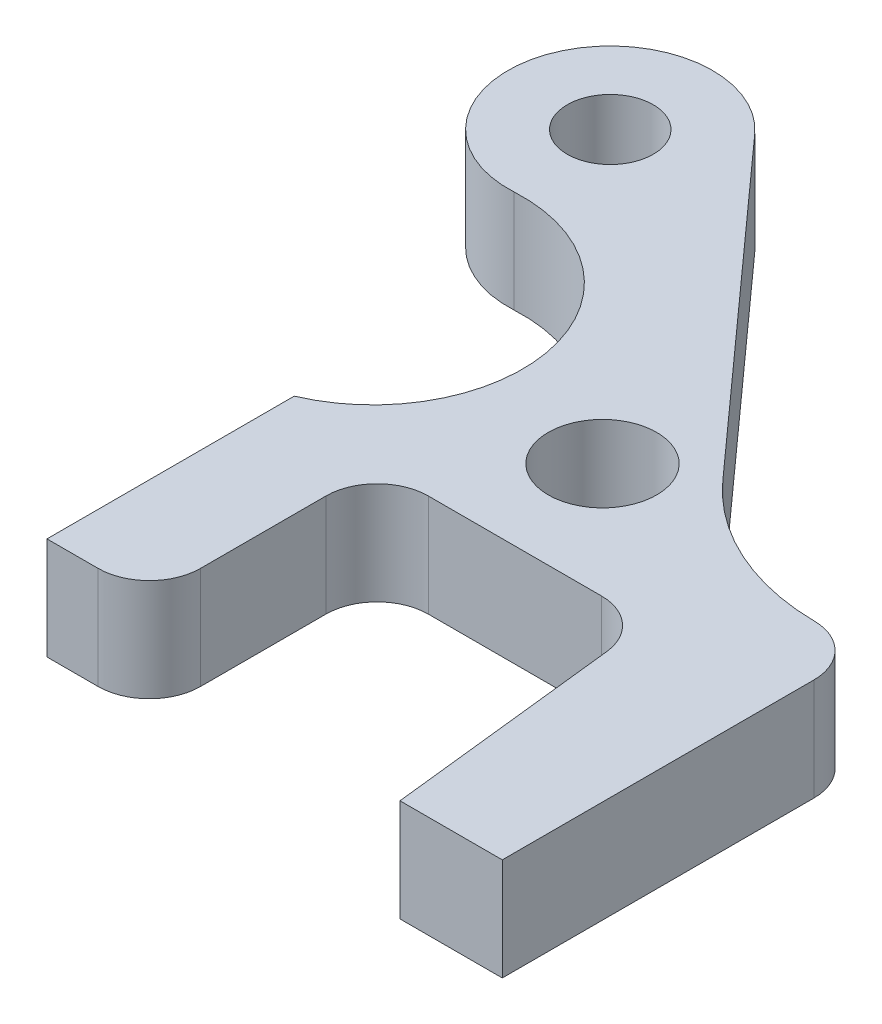
ISO-10303-21;
HEADER;
FILE_DESCRIPTION(('STEP AP214'),'2;1');
FILE_NAME('part.step','',(''),(''),'','','');
FILE_SCHEMA(('AUTOMOTIVE_DESIGN { 1 0 10303 214 1 1 1 1 }'));
ENDSEC;
DATA;
#1=APPLICATION_CONTEXT('core data for automotive mechanical design processes');
#2=APPLICATION_PROTOCOL_DEFINITION('international standard','automotive_design',2000,#1);
#3=PRODUCT_CONTEXT('',#1,'mechanical');
#4=PRODUCT('Part','Part','',(#3));
#5=PRODUCT_RELATED_PRODUCT_CATEGORY('part','',(#4));
#6=PRODUCT_DEFINITION_FORMATION('','',#4);
#7=PRODUCT_DEFINITION_CONTEXT('part definition',#1,'design');
#8=PRODUCT_DEFINITION('design','',#6,#7);
#9=PRODUCT_DEFINITION_SHAPE('','',#8);
#10=(LENGTH_UNIT() NAMED_UNIT(*) SI_UNIT(.MILLI.,.METRE.));
#11=(NAMED_UNIT(*) PLANE_ANGLE_UNIT() SI_UNIT($,.RADIAN.));
#12=(NAMED_UNIT(*) SI_UNIT($,.STERADIAN.) SOLID_ANGLE_UNIT());
#13=UNCERTAINTY_MEASURE_WITH_UNIT(LENGTH_MEASURE(1.E-05),#10,'distance_accuracy_value','');
#14=(GEOMETRIC_REPRESENTATION_CONTEXT(3) GLOBAL_UNCERTAINTY_ASSIGNED_CONTEXT((#13)) GLOBAL_UNIT_ASSIGNED_CONTEXT((#10,
#11,#12)) REPRESENTATION_CONTEXT('',''));
#15=CARTESIAN_POINT('',(0.,0.,0.));
#16=DIRECTION('',(0.,0.,1.));
#17=DIRECTION('',(1.,0.,0.));
#18=AXIS2_PLACEMENT_3D('',#15,#16,#17);
#19=CARTESIAN_POINT('',(0.,-5.,-1.07552855510562E-12));
#20=DIRECTION('',(0.,1.,0.));
#21=DIRECTION('',(0.,0.,1.));
#22=AXIS2_PLACEMENT_3D('',#19,#20,#21);
#23=CYLINDRICAL_SURFACE('',#22,5.00000000000001);
#24=CARTESIAN_POINT('',(0.,0.,-1.07552855510562E-12));
#25=DIRECTION('',(0.,1.,0.));
#26=DIRECTION('',(0.,0.,1.));
#27=AXIS2_PLACEMENT_3D('',#24,#25,#26);
#28=CIRCLE('',#27,5.00000000000001);
#29=CARTESIAN_POINT('',(3.71832057184778,0.,-3.34276713591911));
#30=VERTEX_POINT('',#29);
#31=CARTESIAN_POINT('',(0.291809825642227,0.,4.99147743916047));
#32=VERTEX_POINT('',#31);
#33=EDGE_CURVE('E170',#30,#32,#28,.T.);
#34=ORIENTED_EDGE('',*,*,#33,.F.);
#35=DIRECTION('',(0.,1.,0.));
#36=VECTOR('',#35,1.);
#37=CARTESIAN_POINT('',(3.71832057184778,-5.,-3.34276713591911));
#38=LINE('',#37,#36);
#39=CARTESIAN_POINT('',(3.71832057184778,-5.,-3.34276713591911));
#40=VERTEX_POINT('',#39);
#41=EDGE_CURVE('E11',#40,#30,#38,.T.);
#42=ORIENTED_EDGE('',*,*,#41,.F.);
#43=CARTESIAN_POINT('',(0.,-5.,-1.07552855510562E-12));
#44=DIRECTION('',(0.,1.,0.));
#45=DIRECTION('',(0.,0.,1.));
#46=AXIS2_PLACEMENT_3D('',#43,#44,#45);
#47=CIRCLE('',#46,5.00000000000001);
#48=CARTESIAN_POINT('',(0.291809825642227,-5.,4.99147743916047));
#49=VERTEX_POINT('',#48);
#50=EDGE_CURVE('E212',#40,#49,#47,.T.);
#51=ORIENTED_EDGE('',*,*,#50,.T.);
#52=DIRECTION('',(0.,1.,0.));
#53=VECTOR('',#52,1.);
#54=CARTESIAN_POINT('',(0.291809825642227,-5.,4.99147743916047));
#55=LINE('',#54,#53);
#56=EDGE_CURVE('E34',#49,#32,#55,.T.);
#57=ORIENTED_EDGE('',*,*,#56,.T.);
#58=EDGE_LOOP('',(#34,#42,#51,#57));
#59=FACE_BOUND('',#58,.T.);
#60=ADVANCED_FACE('F31',(#59),#23,.T.);
#61=CARTESIAN_POINT('',(3.71832057184778,-5.,-3.34276713591911));
#62=DIRECTION('',(0.743664114369555,0.,-0.668553427183606));
#63=DIRECTION('',(-0.668553427183606,0.,-0.743664114369555));
#64=AXIS2_PLACEMENT_3D('',#61,#62,#63);
#65=PLANE('',#64);
#66=DIRECTION('',(-0.668553427183606,0.,-0.743664114369555));
#67=VECTOR('',#66,1.);
#68=CARTESIAN_POINT('',(3.71832057184778,0.,-3.34276713591911));
#69=LINE('',#68,#67);
#70=CARTESIAN_POINT('',(17.6183743657092,0.,12.118930873539));
#71=VERTEX_POINT('',#70);
#72=EDGE_CURVE('E210',#71,#30,#69,.T.);
#73=ORIENTED_EDGE('',*,*,#72,.F.);
#74=DIRECTION('',(0.,1.,0.));
#75=VECTOR('',#74,1.);
#76=CARTESIAN_POINT('',(17.6183743657092,-5.,12.118930873539));
#77=LINE('',#76,#75);
#78=CARTESIAN_POINT('',(17.6183743657092,-5.,12.118930873539));
#79=VERTEX_POINT('',#78);
#80=EDGE_CURVE('E40',#79,#71,#77,.T.);
#81=ORIENTED_EDGE('',*,*,#80,.F.);
#82=DIRECTION('',(-0.668553427183606,0.,-0.743664114369555));
#83=VECTOR('',#82,1.);
#84=CARTESIAN_POINT('',(3.71832057184778,-5.,-3.34276713591911));
#85=LINE('',#84,#83);
#86=EDGE_CURVE('E160',#79,#40,#85,.T.);
#87=ORIENTED_EDGE('',*,*,#86,.T.);
#88=ORIENTED_EDGE('',*,*,#41,.T.);
#89=EDGE_LOOP('',(#73,#81,#87,#88));
#90=FACE_BOUND('',#89,.T.);
#91=ADVANCED_FACE('F238',(#90),#65,.T.);
#92=CARTESIAN_POINT('',(25.9164295757043,-5.,4.65898606457902));
#93=DIRECTION('',(0.,1.,0.));
#94=DIRECTION('',(0.,0.,1.));
#95=AXIS2_PLACEMENT_3D('',#92,#93,#94);
#96=CYLINDRICAL_SURFACE('',#95,11.1583375473614);
#97=CARTESIAN_POINT('',(25.9164295757043,0.,4.65898606457902));
#98=DIRECTION('',(0.,-1.,0.));
#99=DIRECTION('',(0.,0.,1.));
#100=AXIS2_PLACEMENT_3D('',#97,#98,#99);
#101=CIRCLE('',#100,11.1583375473614);
#102=CARTESIAN_POINT('',(25.7960671213815,0.,15.8166744318191));
#103=VERTEX_POINT('',#102);
#104=EDGE_CURVE('E147',#103,#71,#101,.T.);
#105=ORIENTED_EDGE('',*,*,#104,.F.);
#106=DIRECTION('',(0.,1.,0.));
#107=VECTOR('',#106,1.);
#108=CARTESIAN_POINT('',(25.7960671213815,-5.,15.8166744318191));
#109=LINE('',#108,#107);
#110=CARTESIAN_POINT('',(25.7960671213815,-5.,15.8166744318191));
#111=VERTEX_POINT('',#110);
#112=EDGE_CURVE('E142',#111,#103,#109,.T.);
#113=ORIENTED_EDGE('',*,*,#112,.F.);
#114=CARTESIAN_POINT('',(25.9164295757043,-5.,4.65898606457902));
#115=DIRECTION('',(0.,-1.,0.));
#116=DIRECTION('',(0.,0.,1.));
#117=AXIS2_PLACEMENT_3D('',#114,#115,#116);
#118=CIRCLE('',#117,11.1583375473614);
#119=EDGE_CURVE('E145',#111,#79,#118,.T.);
#120=ORIENTED_EDGE('',*,*,#119,.T.);
#121=ORIENTED_EDGE('',*,*,#80,.T.);
#122=EDGE_LOOP('',(#105,#113,#120,#121));
#123=FACE_BOUND('',#122,.T.);
#124=ADVANCED_FACE('F144',(#123),#96,.F.);
#125=CARTESIAN_POINT('',(25.7691001888497,-5.,18.3165289844981));
#126=DIRECTION('',(0.,1.,0.));
#127=DIRECTION('',(0.,0.,1.));
#128=AXIS2_PLACEMENT_3D('',#125,#126,#127);
#129=CYLINDRICAL_SURFACE('',#128,2.50000000000001);
#130=CARTESIAN_POINT('',(25.7691001888497,0.,18.3165289844981));
#131=DIRECTION('',(0.,1.,0.));
#132=DIRECTION('',(0.,0.,-1.));
#133=AXIS2_PLACEMENT_3D('',#130,#131,#132);
#134=CIRCLE('',#133,2.50000000000001);
#135=CARTESIAN_POINT('',(28.2691001888497,0.,18.3165289844981));
#136=VERTEX_POINT('',#135);
#137=EDGE_CURVE('E207',#136,#103,#134,.T.);
#138=ORIENTED_EDGE('',*,*,#137,.F.);
#139=DIRECTION('',(0.,1.,0.));
#140=VECTOR('',#139,1.);
#141=CARTESIAN_POINT('',(28.2691001888497,-5.,18.3165289844981));
#142=LINE('',#141,#140);
#143=CARTESIAN_POINT('',(28.2691001888497,-5.,18.3165289844981));
#144=VERTEX_POINT('',#143);
#145=EDGE_CURVE('E152',#144,#136,#142,.T.);
#146=ORIENTED_EDGE('',*,*,#145,.F.);
#147=CARTESIAN_POINT('',(25.7691001888497,-5.,18.3165289844981));
#148=DIRECTION('',(0.,1.,0.));
#149=DIRECTION('',(0.,0.,-1.));
#150=AXIS2_PLACEMENT_3D('',#147,#148,#149);
#151=CIRCLE('',#150,2.50000000000001);
#152=EDGE_CURVE('E158',#144,#111,#151,.T.);
#153=ORIENTED_EDGE('',*,*,#152,.T.);
#154=ORIENTED_EDGE('',*,*,#112,.T.);
#155=EDGE_LOOP('',(#138,#146,#153,#154));
#156=FACE_BOUND('',#155,.T.);
#157=ADVANCED_FACE('F162',(#156),#129,.T.);
#158=CARTESIAN_POINT('',(28.2691001888498,-5.,33.5446843123103));
#159=DIRECTION('',(1.,0.,0.));
#160=DIRECTION('',(0.,0.,-1.));
#161=AXIS2_PLACEMENT_3D('',#158,#159,#160);
#162=PLANE('',#161);
#163=DIRECTION('',(0.,0.,-1.));
#164=VECTOR('',#163,1.);
#165=CARTESIAN_POINT('',(28.2691001888498,0.,33.5446843123103));
#166=LINE('',#165,#164);
#167=CARTESIAN_POINT('',(28.2691001888498,0.,33.5446843123103));
#168=VERTEX_POINT('',#167);
#169=EDGE_CURVE('E204',#168,#136,#166,.T.);
#170=ORIENTED_EDGE('',*,*,#169,.F.);
#171=DIRECTION('',(0.,1.,0.));
#172=VECTOR('',#171,1.);
#173=CARTESIAN_POINT('',(28.2691001888498,-5.,33.5446843123103));
#174=LINE('',#173,#172);
#175=CARTESIAN_POINT('',(28.2691001888498,-5.,33.5446843123103));
#176=VERTEX_POINT('',#175);
#177=EDGE_CURVE('E216',#176,#168,#174,.T.);
#178=ORIENTED_EDGE('',*,*,#177,.F.);
#179=DIRECTION('',(0.,0.,-1.));
#180=VECTOR('',#179,1.);
#181=CARTESIAN_POINT('',(28.2691001888498,-5.,33.5446843123103));
#182=LINE('',#181,#180);
#183=EDGE_CURVE('E163',#176,#144,#182,.T.);
#184=ORIENTED_EDGE('',*,*,#183,.T.);
#185=ORIENTED_EDGE('',*,*,#145,.T.);
#186=EDGE_LOOP('',(#170,#178,#184,#185));
#187=FACE_BOUND('',#186,.T.);
#188=ADVANCED_FACE('F251',(#187),#162,.T.);
#189=CARTESIAN_POINT('',(23.2691001888498,-5.,33.5446843123103));
#190=DIRECTION('',(0.,0.,1.));
#191=DIRECTION('',(1.,0.,0.));
#192=AXIS2_PLACEMENT_3D('',#189,#190,#191);
#193=PLANE('',#192);
#194=DIRECTION('',(1.,0.,0.));
#195=VECTOR('',#194,1.);
#196=CARTESIAN_POINT('',(23.2691001888498,0.,33.5446843123103));
#197=LINE('',#196,#195);
#198=CARTESIAN_POINT('',(23.2691001888498,0.,33.5446843123103));
#199=VERTEX_POINT('',#198);
#200=EDGE_CURVE('E201',#199,#168,#197,.T.);
#201=ORIENTED_EDGE('',*,*,#200,.F.);
#202=DIRECTION('',(0.,1.,0.));
#203=VECTOR('',#202,1.);
#204=CARTESIAN_POINT('',(23.2691001888498,-5.,33.5446843123103));
#205=LINE('',#204,#203);
#206=CARTESIAN_POINT('',(23.2691001888498,-5.,33.5446843123103));
#207=VERTEX_POINT('',#206);
#208=EDGE_CURVE('E218',#207,#199,#205,.T.);
#209=ORIENTED_EDGE('',*,*,#208,.F.);
#210=DIRECTION('',(1.,0.,0.));
#211=VECTOR('',#210,1.);
#212=CARTESIAN_POINT('',(23.2691001888498,-5.,33.5446843123103));
#213=LINE('',#212,#211);
#214=EDGE_CURVE('E165',#207,#176,#213,.T.);
#215=ORIENTED_EDGE('',*,*,#214,.T.);
#216=ORIENTED_EDGE('',*,*,#177,.T.);
#217=EDGE_LOOP('',(#201,#209,#215,#216));
#218=FACE_BOUND('',#217,.T.);
#219=ADVANCED_FACE('F254',(#218),#193,.T.);
#220=CARTESIAN_POINT('',(22.0073956861614,-5.,22.1778849571099));
#221=DIRECTION('',(-0.993895947407551,0.,0.110321556038912));
#222=DIRECTION('',(0.110321556038912,0.,0.993895947407551));
#223=AXIS2_PLACEMENT_3D('',#220,#221,#222);
#224=PLANE('',#223);
#225=DIRECTION('',(0.110321556038912,0.,0.993895947407551));
#226=VECTOR('',#225,1.);
#227=CARTESIAN_POINT('',(22.0073956861614,0.,22.1778849571099));
#228=LINE('',#227,#226);
#229=CARTESIAN_POINT('',(22.0073956861614,0.,22.1778849571099));
#230=VERTEX_POINT('',#229);
#231=EDGE_CURVE('E198',#230,#199,#228,.T.);
#232=ORIENTED_EDGE('',*,*,#231,.F.);
#233=DIRECTION('',(0.,1.,0.));
#234=VECTOR('',#233,1.);
#235=CARTESIAN_POINT('',(22.0073956861614,-5.,22.1778849571099));
#236=LINE('',#235,#234);
#237=CARTESIAN_POINT('',(22.0073956861614,-5.,22.1778849571099));
#238=VERTEX_POINT('',#237);
#239=EDGE_CURVE('E220',#238,#230,#236,.T.);
#240=ORIENTED_EDGE('',*,*,#239,.F.);
#241=DIRECTION('',(0.110321556038912,0.,0.993895947407551));
#242=VECTOR('',#241,1.);
#243=CARTESIAN_POINT('',(22.0073956861614,-5.,22.1778849571099));
#244=LINE('',#243,#242);
#245=EDGE_CURVE('E349',#238,#207,#244,.T.);
#246=ORIENTED_EDGE('',*,*,#245,.T.);
#247=ORIENTED_EDGE('',*,*,#208,.T.);
#248=EDGE_LOOP('',(#232,#240,#246,#247));
#249=FACE_BOUND('',#248,.T.);
#250=ADVANCED_FACE('F258',(#249),#224,.T.);
#251=CARTESIAN_POINT('',(19.5226558176426,-5.,22.4536888472072));
#252=DIRECTION('',(0.,1.,0.));
#253=DIRECTION('',(0.,0.,1.));
#254=AXIS2_PLACEMENT_3D('',#251,#252,#253);
#255=CYLINDRICAL_SURFACE('',#254,2.5);
#256=CARTESIAN_POINT('',(19.5226558176426,0.,22.4536888472072));
#257=DIRECTION('',(0.,-1.,0.));
#258=DIRECTION('',(0.,0.,-1.));
#259=AXIS2_PLACEMENT_3D('',#256,#257,#258);
#260=CIRCLE('',#259,2.5);
#261=CARTESIAN_POINT('',(19.5226558176426,0.,19.9536888472072));
#262=VERTEX_POINT('',#261);
#263=EDGE_CURVE('E195',#262,#230,#260,.T.);
#264=ORIENTED_EDGE('',*,*,#263,.F.);
#265=DIRECTION('',(0.,1.,0.));
#266=VECTOR('',#265,1.);
#267=CARTESIAN_POINT('',(19.5226558176426,-5.,19.9536888472072));
#268=LINE('',#267,#266);
#269=CARTESIAN_POINT('',(19.5226558176426,-5.,19.9536888472072));
#270=VERTEX_POINT('',#269);
#271=EDGE_CURVE('E222',#270,#262,#268,.T.);
#272=ORIENTED_EDGE('',*,*,#271,.F.);
#273=CARTESIAN_POINT('',(19.5226558176426,-5.,22.4536888472072));
#274=DIRECTION('',(0.,-1.,0.));
#275=DIRECTION('',(0.,0.,-1.));
#276=AXIS2_PLACEMENT_3D('',#273,#274,#275);
#277=CIRCLE('',#276,2.5);
#278=EDGE_CURVE('E346',#270,#238,#277,.T.);
#279=ORIENTED_EDGE('',*,*,#278,.T.);
#280=ORIENTED_EDGE('',*,*,#239,.T.);
#281=EDGE_LOOP('',(#264,#272,#279,#280));
#282=FACE_BOUND('',#281,.T.);
#283=ADVANCED_FACE('F262',(#282),#255,.F.);
#284=CARTESIAN_POINT('',(11.0616912661466,-5.,19.9536888472072));
#285=DIRECTION('',(0.,0.,1.));
#286=DIRECTION('',(1.,0.,0.));
#287=AXIS2_PLACEMENT_3D('',#284,#285,#286);
#288=PLANE('',#287);
#289=DIRECTION('',(1.,0.,0.));
#290=VECTOR('',#289,1.);
#291=CARTESIAN_POINT('',(11.0616912661466,0.,19.9536888472072));
#292=LINE('',#291,#290);
#293=CARTESIAN_POINT('',(11.0616912661466,0.,19.9536888472072));
#294=VERTEX_POINT('',#293);
#295=EDGE_CURVE('E192',#294,#262,#292,.T.);
#296=ORIENTED_EDGE('',*,*,#295,.F.);
#297=DIRECTION('',(0.,1.,0.));
#298=VECTOR('',#297,1.);
#299=CARTESIAN_POINT('',(11.0616912661466,-5.,19.9536888472072));
#300=LINE('',#299,#298);
#301=CARTESIAN_POINT('',(11.0616912661466,-5.,19.9536888472072));
#302=VERTEX_POINT('',#301);
#303=EDGE_CURVE('E224',#302,#294,#300,.T.);
#304=ORIENTED_EDGE('',*,*,#303,.F.);
#305=DIRECTION('',(1.,0.,0.));
#306=VECTOR('',#305,1.);
#307=CARTESIAN_POINT('',(11.0616912661466,-5.,19.9536888472072));
#308=LINE('',#307,#306);
#309=EDGE_CURVE('E343',#302,#270,#308,.T.);
#310=ORIENTED_EDGE('',*,*,#309,.T.);
#311=ORIENTED_EDGE('',*,*,#271,.T.);
#312=EDGE_LOOP('',(#296,#304,#310,#311));
#313=FACE_BOUND('',#312,.T.);
#314=ADVANCED_FACE('F266',(#313),#288,.T.);
#315=CARTESIAN_POINT('',(11.0616912661466,-5.,22.4536888472072));
#316=DIRECTION('',(0.,1.,0.));
#317=DIRECTION('',(0.,0.,1.));
#318=AXIS2_PLACEMENT_3D('',#315,#316,#317);
#319=CYLINDRICAL_SURFACE('',#318,2.5);
#320=CARTESIAN_POINT('',(11.0616912661466,0.,22.4536888472072));
#321=DIRECTION('',(0.,-1.,0.));
#322=DIRECTION('',(0.,0.,1.));
#323=AXIS2_PLACEMENT_3D('',#320,#321,#322);
#324=CIRCLE('',#323,2.5);
#325=CARTESIAN_POINT('',(8.56169126614657,0.,22.4536888472072));
#326=VERTEX_POINT('',#325);
#327=EDGE_CURVE('E189',#326,#294,#324,.T.);
#328=ORIENTED_EDGE('',*,*,#327,.F.);
#329=DIRECTION('',(0.,1.,0.));
#330=VECTOR('',#329,1.);
#331=CARTESIAN_POINT('',(8.56169126614657,-5.,22.4536888472072));
#332=LINE('',#331,#330);
#333=CARTESIAN_POINT('',(8.56169126614657,-5.,22.4536888472072));
#334=VERTEX_POINT('',#333);
#335=EDGE_CURVE('E226',#334,#326,#332,.T.);
#336=ORIENTED_EDGE('',*,*,#335,.F.);
#337=CARTESIAN_POINT('',(11.0616912661466,-5.,22.4536888472072));
#338=DIRECTION('',(0.,-1.,0.));
#339=DIRECTION('',(0.,0.,1.));
#340=AXIS2_PLACEMENT_3D('',#337,#338,#339);
#341=CIRCLE('',#340,2.5);
#342=EDGE_CURVE('E340',#334,#302,#341,.T.);
#343=ORIENTED_EDGE('',*,*,#342,.T.);
#344=ORIENTED_EDGE('',*,*,#303,.T.);
#345=EDGE_LOOP('',(#328,#336,#343,#344));
#346=FACE_BOUND('',#345,.T.);
#347=ADVANCED_FACE('F270',(#346),#319,.F.);
#348=CARTESIAN_POINT('',(8.56169126614662,-5.,28.5855436692577));
#349=DIRECTION('',(1.,0.,0.));
#350=DIRECTION('',(0.,0.,-1.));
#351=AXIS2_PLACEMENT_3D('',#348,#349,#350);
#352=PLANE('',#351);
#353=DIRECTION('',(0.,0.,-1.));
#354=VECTOR('',#353,1.);
#355=CARTESIAN_POINT('',(8.56169126614662,0.,28.5855436692577));
#356=LINE('',#355,#354);
#357=CARTESIAN_POINT('',(8.56169126614662,0.,28.5855436692577));
#358=VERTEX_POINT('',#357);
#359=EDGE_CURVE('E186',#358,#326,#356,.T.);
#360=ORIENTED_EDGE('',*,*,#359,.F.);
#361=DIRECTION('',(0.,1.,0.));
#362=VECTOR('',#361,1.);
#363=CARTESIAN_POINT('',(8.56169126614662,-5.,28.5855436692577));
#364=LINE('',#363,#362);
#365=CARTESIAN_POINT('',(8.56169126614662,-5.,28.5855436692577));
#366=VERTEX_POINT('',#365);
#367=EDGE_CURVE('E228',#366,#358,#364,.T.);
#368=ORIENTED_EDGE('',*,*,#367,.F.);
#369=DIRECTION('',(0.,0.,-1.));
#370=VECTOR('',#369,1.);
#371=CARTESIAN_POINT('',(8.56169126614662,-5.,28.5855436692577));
#372=LINE('',#371,#370);
#373=EDGE_CURVE('E337',#366,#334,#372,.T.);
#374=ORIENTED_EDGE('',*,*,#373,.T.);
#375=ORIENTED_EDGE('',*,*,#335,.T.);
#376=EDGE_LOOP('',(#360,#368,#374,#375));
#377=FACE_BOUND('',#376,.T.);
#378=ADVANCED_FACE('F274',(#377),#352,.T.);
#379=CARTESIAN_POINT('',(6.06169126614661,-5.,28.5855436692577));
#380=DIRECTION('',(0.,1.,0.));
#381=DIRECTION('',(0.,0.,1.));
#382=AXIS2_PLACEMENT_3D('',#379,#380,#381);
#383=CYLINDRICAL_SURFACE('',#382,2.5);
#384=CARTESIAN_POINT('',(6.06169126614661,0.,28.5855436692577));
#385=DIRECTION('',(0.,1.,0.));
#386=DIRECTION('',(0.,0.,1.));
#387=AXIS2_PLACEMENT_3D('',#384,#385,#386);
#388=CIRCLE('',#387,2.5);
#389=CARTESIAN_POINT('',(6.06169126614661,0.,31.0855436692577));
#390=VERTEX_POINT('',#389);
#391=EDGE_CURVE('E183',#390,#358,#388,.T.);
#392=ORIENTED_EDGE('',*,*,#391,.F.);
#393=DIRECTION('',(0.,1.,0.));
#394=VECTOR('',#393,1.);
#395=CARTESIAN_POINT('',(6.06169126614661,-5.,31.0855436692577));
#396=LINE('',#395,#394);
#397=CARTESIAN_POINT('',(6.06169126614661,-5.,31.0855436692577));
#398=VERTEX_POINT('',#397);
#399=EDGE_CURVE('E230',#398,#390,#396,.T.);
#400=ORIENTED_EDGE('',*,*,#399,.F.);
#401=CARTESIAN_POINT('',(6.06169126614661,-5.,28.5855436692577));
#402=DIRECTION('',(0.,1.,0.));
#403=DIRECTION('',(0.,0.,1.));
#404=AXIS2_PLACEMENT_3D('',#401,#402,#403);
#405=CIRCLE('',#404,2.5);
#406=EDGE_CURVE('E334',#398,#366,#405,.T.);
#407=ORIENTED_EDGE('',*,*,#406,.T.);
#408=ORIENTED_EDGE('',*,*,#367,.T.);
#409=EDGE_LOOP('',(#392,#400,#407,#408));
#410=FACE_BOUND('',#409,.T.);
#411=ADVANCED_FACE('F278',(#410),#383,.T.);
#412=CARTESIAN_POINT('',(3.56169126614664,-5.,31.0855436692577));
#413=DIRECTION('',(0.,0.,1.));
#414=DIRECTION('',(1.,0.,0.));
#415=AXIS2_PLACEMENT_3D('',#412,#413,#414);
#416=PLANE('',#415);
#417=DIRECTION('',(1.,0.,0.));
#418=VECTOR('',#417,1.);
#419=CARTESIAN_POINT('',(3.56169126614664,0.,31.0855436692577));
#420=LINE('',#419,#418);
#421=CARTESIAN_POINT('',(3.56169126614664,0.,31.0855436692577));
#422=VERTEX_POINT('',#421);
#423=EDGE_CURVE('E180',#422,#390,#420,.T.);
#424=ORIENTED_EDGE('',*,*,#423,.F.);
#425=DIRECTION('',(0.,1.,0.));
#426=VECTOR('',#425,1.);
#427=CARTESIAN_POINT('',(3.56169126614664,-5.,31.0855436692577));
#428=LINE('',#427,#426);
#429=CARTESIAN_POINT('',(3.56169126614664,-5.,31.0855436692577));
#430=VERTEX_POINT('',#429);
#431=EDGE_CURVE('E232',#430,#422,#428,.T.);
#432=ORIENTED_EDGE('',*,*,#431,.F.);
#433=DIRECTION('',(1.,0.,0.));
#434=VECTOR('',#433,1.);
#435=CARTESIAN_POINT('',(3.56169126614664,-5.,31.0855436692577));
#436=LINE('',#435,#434);
#437=EDGE_CURVE('E331',#430,#398,#436,.T.);
#438=ORIENTED_EDGE('',*,*,#437,.T.);
#439=ORIENTED_EDGE('',*,*,#399,.T.);
#440=EDGE_LOOP('',(#424,#432,#438,#439));
#441=FACE_BOUND('',#440,.T.);
#442=ADVANCED_FACE('F282',(#441),#416,.T.);
#443=CARTESIAN_POINT('',(3.56169126614655,-5.,19.0057095877779));
#444=DIRECTION('',(-1.,0.,0.));
#445=DIRECTION('',(0.,0.,1.));
#446=AXIS2_PLACEMENT_3D('',#443,#444,#445);
#447=PLANE('',#446);
#448=DIRECTION('',(0.,0.,1.));
#449=VECTOR('',#448,1.);
#450=CARTESIAN_POINT('',(3.56169126614655,0.,19.0057095877779));
#451=LINE('',#450,#449);
#452=CARTESIAN_POINT('',(3.56169126614655,0.,19.0057095877779));
#453=VERTEX_POINT('',#452);
#454=EDGE_CURVE('E177',#453,#422,#451,.T.);
#455=ORIENTED_EDGE('',*,*,#454,.F.);
#456=DIRECTION('',(0.,1.,0.));
#457=VECTOR('',#456,1.);
#458=CARTESIAN_POINT('',(3.56169126614655,-5.,19.0057095877779));
#459=LINE('',#458,#457);
#460=CARTESIAN_POINT('',(3.56169126614655,-5.,19.0057095877779));
#461=VERTEX_POINT('',#460);
#462=EDGE_CURVE('E233',#461,#453,#459,.T.);
#463=ORIENTED_EDGE('',*,*,#462,.F.);
#464=DIRECTION('',(0.,0.,1.));
#465=VECTOR('',#464,1.);
#466=CARTESIAN_POINT('',(3.56169126614655,-5.,19.0057095877779));
#467=LINE('',#466,#465);
#468=EDGE_CURVE('E328',#461,#430,#467,.T.);
#469=ORIENTED_EDGE('',*,*,#468,.T.);
#470=ORIENTED_EDGE('',*,*,#431,.T.);
#471=EDGE_LOOP('',(#455,#463,#469,#470));
#472=FACE_BOUND('',#471,.T.);
#473=ADVANCED_FACE('F286',(#472),#447,.T.);
#474=CARTESIAN_POINT('',(0.692320378923694,-5.,12.2866178768286));
#475=DIRECTION('',(0.,1.,0.));
#476=DIRECTION('',(0.,0.,1.));
#477=AXIS2_PLACEMENT_3D('',#474,#475,#476);
#478=CYLINDRICAL_SURFACE('',#477,7.30612638192019);
#479=CARTESIAN_POINT('',(0.692320378923694,0.,12.2866178768286));
#480=DIRECTION('',(0.,-1.,0.));
#481=DIRECTION('',(0.,0.,-1.));
#482=AXIS2_PLACEMENT_3D('',#479,#480,#481);
#483=CIRCLE('',#482,7.30612638192019);
#484=EDGE_CURVE('E173',#32,#453,#483,.T.);
#485=ORIENTED_EDGE('',*,*,#484,.F.);
#486=ORIENTED_EDGE('',*,*,#56,.F.);
#487=CARTESIAN_POINT('',(0.692320378923694,-5.,12.2866178768286));
#488=DIRECTION('',(0.,-1.,0.));
#489=DIRECTION('',(0.,0.,-1.));
#490=AXIS2_PLACEMENT_3D('',#487,#488,#489);
#491=CIRCLE('',#490,7.30612638192019);
#492=EDGE_CURVE('E326',#49,#461,#491,.T.);
#493=ORIENTED_EDGE('',*,*,#492,.T.);
#494=ORIENTED_EDGE('',*,*,#462,.T.);
#495=EDGE_LOOP('',(#485,#486,#493,#494));
#496=FACE_BOUND('',#495,.T.);
#497=ADVANCED_FACE('F235',(#496),#478,.F.);
#498=CARTESIAN_POINT('',(0.,-5.,-1.07552855510562E-12));
#499=DIRECTION('',(0.,1.,0.));
#500=DIRECTION('',(0.,0.,1.));
#501=AXIS2_PLACEMENT_3D('',#498,#499,#500);
#502=PLANE('',#501);
#503=CARTESIAN_POINT('',(0.,-5.,0.));
#504=DIRECTION('',(0.,1.,0.));
#505=DIRECTION('',(0.,0.,1.));
#506=AXIS2_PLACEMENT_3D('',#503,#504,#505);
#507=CIRCLE('',#506,2.1);
#508=CARTESIAN_POINT('',(0.,-5.,2.1));
#509=VERTEX_POINT('',#508);
#510=EDGE_CURVE('E313',#509,#509,#507,.T.);
#511=ORIENTED_EDGE('',*,*,#510,.T.);
#512=EDGE_LOOP('',(#511));
#513=FACE_BOUND('',#512,.T.);
#514=CARTESIAN_POINT('',(13.9511485113722,-5.,14.330577630145));
#515=DIRECTION('',(0.,1.,0.));
#516=DIRECTION('',(0.,0.,1.));
#517=AXIS2_PLACEMENT_3D('',#514,#515,#516);
#518=CIRCLE('',#517,2.65);
#519=CARTESIAN_POINT('',(13.9511485113722,-5.,16.980577630145));
#520=VERTEX_POINT('',#519);
#521=EDGE_CURVE('E174',#520,#520,#518,.T.);
#522=ORIENTED_EDGE('',*,*,#521,.T.);
#523=EDGE_LOOP('',(#522));
#524=FACE_BOUND('',#523,.T.);
#525=ORIENTED_EDGE('',*,*,#50,.F.);
#526=ORIENTED_EDGE('',*,*,#86,.F.);
#527=ORIENTED_EDGE('',*,*,#119,.F.);
#528=ORIENTED_EDGE('',*,*,#152,.F.);
#529=ORIENTED_EDGE('',*,*,#183,.F.);
#530=ORIENTED_EDGE('',*,*,#214,.F.);
#531=ORIENTED_EDGE('',*,*,#245,.F.);
#532=ORIENTED_EDGE('',*,*,#278,.F.);
#533=ORIENTED_EDGE('',*,*,#309,.F.);
#534=ORIENTED_EDGE('',*,*,#342,.F.);
#535=ORIENTED_EDGE('',*,*,#373,.F.);
#536=ORIENTED_EDGE('',*,*,#406,.F.);
#537=ORIENTED_EDGE('',*,*,#437,.F.);
#538=ORIENTED_EDGE('',*,*,#468,.F.);
#539=ORIENTED_EDGE('',*,*,#492,.F.);
#540=EDGE_LOOP('',(#525,#526,#527,#528,#529,#530,#531,#532,#533,#534,#535,#536,#537,#538,#539));
#541=FACE_BOUND('',#540,.T.);
#542=ADVANCED_FACE('F156',(#513,#524,#541),#502,.F.);
#543=CARTESIAN_POINT('',(0.,0.,-1.07552855510562E-12));
#544=DIRECTION('',(0.,1.,0.));
#545=DIRECTION('',(0.,0.,1.));
#546=AXIS2_PLACEMENT_3D('',#543,#544,#545);
#547=PLANE('',#546);
#548=CARTESIAN_POINT('',(0.,0.,0.));
#549=DIRECTION('',(0.,1.,0.));
#550=DIRECTION('',(0.,0.,1.));
#551=AXIS2_PLACEMENT_3D('',#548,#549,#550);
#552=CIRCLE('',#551,2.09999999999999);
#553=CARTESIAN_POINT('',(0.,0.,2.09999999999999));
#554=VERTEX_POINT('',#553);
#555=EDGE_CURVE('E316',#554,#554,#552,.T.);
#556=ORIENTED_EDGE('',*,*,#555,.F.);
#557=EDGE_LOOP('',(#556));
#558=FACE_BOUND('',#557,.T.);
#559=CARTESIAN_POINT('',(13.9511485113722,0.,14.330577630145));
#560=DIRECTION('',(0.,1.,0.));
#561=DIRECTION('',(0.,0.,1.));
#562=AXIS2_PLACEMENT_3D('',#559,#560,#561);
#563=CIRCLE('',#562,2.64999999999999);
#564=CARTESIAN_POINT('',(13.9511485113722,0.,16.980577630145));
#565=VERTEX_POINT('',#564);
#566=EDGE_CURVE('E318',#565,#565,#563,.T.);
#567=ORIENTED_EDGE('',*,*,#566,.F.);
#568=EDGE_LOOP('',(#567));
#569=FACE_BOUND('',#568,.T.);
#570=ORIENTED_EDGE('',*,*,#33,.T.);
#571=ORIENTED_EDGE('',*,*,#484,.T.);
#572=ORIENTED_EDGE('',*,*,#454,.T.);
#573=ORIENTED_EDGE('',*,*,#423,.T.);
#574=ORIENTED_EDGE('',*,*,#391,.T.);
#575=ORIENTED_EDGE('',*,*,#359,.T.);
#576=ORIENTED_EDGE('',*,*,#327,.T.);
#577=ORIENTED_EDGE('',*,*,#295,.T.);
#578=ORIENTED_EDGE('',*,*,#263,.T.);
#579=ORIENTED_EDGE('',*,*,#231,.T.);
#580=ORIENTED_EDGE('',*,*,#200,.T.);
#581=ORIENTED_EDGE('',*,*,#169,.T.);
#582=ORIENTED_EDGE('',*,*,#137,.T.);
#583=ORIENTED_EDGE('',*,*,#104,.T.);
#584=ORIENTED_EDGE('',*,*,#72,.T.);
#585=EDGE_LOOP('',(#570,#571,#572,#573,#574,#575,#576,#577,#578,#579,#580,#581,#582,#583,#584));
#586=FACE_BOUND('',#585,.T.);
#587=ADVANCED_FACE('F237',(#558,#569,#586),#547,.T.);
#588=CARTESIAN_POINT('',(13.9511485113722,0.,14.330577630145));
#589=DIRECTION('',(0.,1.,0.));
#590=DIRECTION('',(0.,0.,1.));
#591=AXIS2_PLACEMENT_3D('',#588,#589,#590);
#592=CYLINDRICAL_SURFACE('',#591,2.64999999999999);
#593=ORIENTED_EDGE('',*,*,#521,.F.);
#594=EDGE_LOOP('',(#593));
#595=FACE_BOUND('',#594,.T.);
#596=ORIENTED_EDGE('',*,*,#566,.T.);
#597=EDGE_LOOP('',(#596));
#598=FACE_BOUND('',#597,.T.);
#599=ADVANCED_FACE('F298',(#595,#598),#592,.F.);
#600=CARTESIAN_POINT('',(0.,0.,0.));
#601=DIRECTION('',(0.,1.,0.));
#602=DIRECTION('',(0.,0.,1.));
#603=AXIS2_PLACEMENT_3D('',#600,#601,#602);
#604=CYLINDRICAL_SURFACE('',#603,2.09999999999999);
#605=ORIENTED_EDGE('',*,*,#510,.F.);
#606=EDGE_LOOP('',(#605));
#607=FACE_BOUND('',#606,.T.);
#608=ORIENTED_EDGE('',*,*,#555,.T.);
#609=EDGE_LOOP('',(#608));
#610=FACE_BOUND('',#609,.T.);
#611=ADVANCED_FACE('F305',(#607,#610),#604,.F.);
#612=CLOSED_SHELL('',(#60,#91,#124,#157,#188,#219,#250,#283,#314,#347,#378,#411,#442,#473,#497,
#542,#587,#599,#611));
#613=MANIFOLD_SOLID_BREP('B2',#612);
#614=ADVANCED_BREP_SHAPE_REPRESENTATION('',(#18,#613),#14);
#615=SHAPE_DEFINITION_REPRESENTATION(#9,#614);
ENDSEC;
END-ISO-10303-21;
